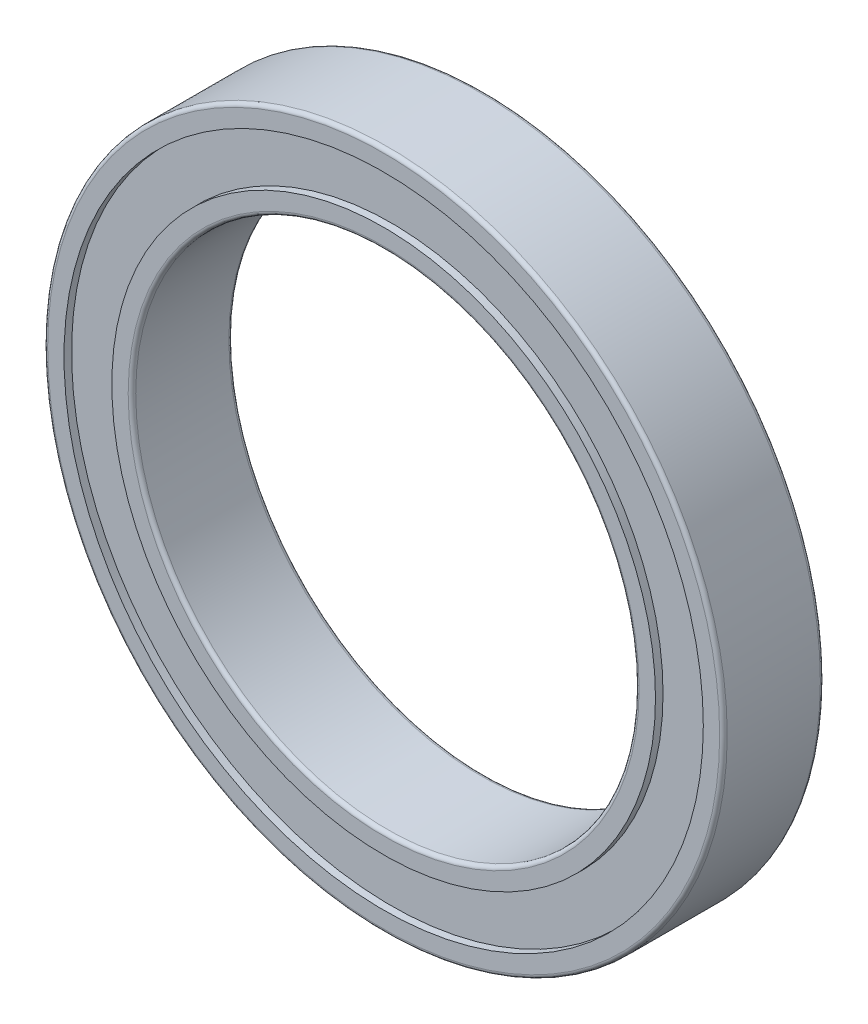
ISO-10303-21;
HEADER;
FILE_DESCRIPTION(('STEP AP214'),'2;1');
FILE_NAME('part.step','',(''),(''),'','','');
FILE_SCHEMA(('AUTOMOTIVE_DESIGN { 1 0 10303 214 1 1 1 1 }'));
ENDSEC;
DATA;
#1=APPLICATION_CONTEXT('core data for automotive mechanical design processes');
#2=APPLICATION_PROTOCOL_DEFINITION('international standard','automotive_design',2000,#1);
#3=PRODUCT_CONTEXT('',#1,'mechanical');
#4=PRODUCT('Part','Part','',(#3));
#5=PRODUCT_RELATED_PRODUCT_CATEGORY('part','',(#4));
#6=PRODUCT_DEFINITION_FORMATION('','',#4);
#7=PRODUCT_DEFINITION_CONTEXT('part definition',#1,'design');
#8=PRODUCT_DEFINITION('design','',#6,#7);
#9=PRODUCT_DEFINITION_SHAPE('','',#8);
#10=(LENGTH_UNIT() NAMED_UNIT(*) SI_UNIT(.MILLI.,.METRE.));
#11=(NAMED_UNIT(*) PLANE_ANGLE_UNIT() SI_UNIT($,.RADIAN.));
#12=(NAMED_UNIT(*) SI_UNIT($,.STERADIAN.) SOLID_ANGLE_UNIT());
#13=UNCERTAINTY_MEASURE_WITH_UNIT(LENGTH_MEASURE(1.E-05),#10,'distance_accuracy_value','');
#14=(GEOMETRIC_REPRESENTATION_CONTEXT(3) GLOBAL_UNCERTAINTY_ASSIGNED_CONTEXT((#13)) GLOBAL_UNIT_ASSIGNED_CONTEXT((#10,
#11,#12)) REPRESENTATION_CONTEXT('',''));
#15=CARTESIAN_POINT('',(0.,0.,0.));
#16=DIRECTION('',(0.,0.,1.));
#17=DIRECTION('',(1.,0.,0.));
#18=AXIS2_PLACEMENT_3D('',#15,#16,#17);
#19=CARTESIAN_POINT('',(0.,0.,0.));
#20=DIRECTION('',(0.,0.,1.));
#21=DIRECTION('',(1.,0.,0.));
#22=AXIS2_PLACEMENT_3D('',#19,#20,#21);
#23=PLANE('',#22);
#24=CARTESIAN_POINT('',(0.,0.,0.));
#25=DIRECTION('',(0.,0.,1.));
#26=DIRECTION('',(1.,0.,0.));
#27=AXIS2_PLACEMENT_3D('',#24,#25,#26);
#28=CIRCLE('',#27,10.15);
#29=CARTESIAN_POINT('',(10.15,0.,0.));
#30=VERTEX_POINT('',#29);
#31=EDGE_CURVE('E62',#30,#30,#28,.T.);
#32=ORIENTED_EDGE('',*,*,#31,.T.);
#33=EDGE_LOOP('',(#32));
#34=FACE_BOUND('',#33,.T.);
#35=CARTESIAN_POINT('',(0.,0.,0.));
#36=DIRECTION('',(0.,0.,1.));
#37=DIRECTION('',(1.,0.,0.));
#38=AXIS2_PLACEMENT_3D('',#35,#36,#37);
#39=CIRCLE('',#38,10.8);
#40=CARTESIAN_POINT('',(10.8,0.,0.));
#41=VERTEX_POINT('',#40);
#42=EDGE_CURVE('E84',#41,#41,#39,.T.);
#43=ORIENTED_EDGE('',*,*,#42,.F.);
#44=EDGE_LOOP('',(#43));
#45=FACE_BOUND('',#44,.T.);
#46=ADVANCED_FACE('F33',(#34,#45),#23,.F.);
#47=CARTESIAN_POINT('',(0.,0.,4.));
#48=DIRECTION('',(0.,0.,1.));
#49=DIRECTION('',(1.,0.,0.));
#50=AXIS2_PLACEMENT_3D('',#47,#48,#49);
#51=PLANE('',#50);
#52=CARTESIAN_POINT('',(0.,0.,4.));
#53=DIRECTION('',(0.,0.,1.));
#54=DIRECTION('',(1.,0.,0.));
#55=AXIS2_PLACEMENT_3D('',#52,#53,#54);
#56=CIRCLE('',#55,10.15);
#57=CARTESIAN_POINT('',(10.15,0.,4.));
#58=VERTEX_POINT('',#57);
#59=EDGE_CURVE('E40',#58,#58,#56,.F.);
#60=ORIENTED_EDGE('',*,*,#59,.T.);
#61=EDGE_LOOP('',(#60));
#62=FACE_BOUND('',#61,.T.);
#63=CARTESIAN_POINT('',(0.,0.,4.));
#64=DIRECTION('',(0.,0.,1.));
#65=DIRECTION('',(1.,0.,0.));
#66=AXIS2_PLACEMENT_3D('',#63,#64,#65);
#67=CIRCLE('',#66,10.8);
#68=CARTESIAN_POINT('',(10.8,0.,4.));
#69=VERTEX_POINT('',#68);
#70=EDGE_CURVE('E72',#69,#69,#67,.T.);
#71=ORIENTED_EDGE('',*,*,#70,.T.);
#72=EDGE_LOOP('',(#71));
#73=FACE_BOUND('',#72,.T.);
#74=ADVANCED_FACE('F101',(#62,#73),#51,.T.);
#75=CARTESIAN_POINT('',(0.,0.,4.));
#76=DIRECTION('',(0.,0.,1.));
#77=DIRECTION('',(1.,0.,0.));
#78=AXIS2_PLACEMENT_3D('',#75,#76,#77);
#79=CIRCLE('',#78,13.35);
#80=CARTESIAN_POINT('',(13.35,0.,4.));
#81=VERTEX_POINT('',#80);
#82=EDGE_CURVE('E10',#81,#81,#79,.T.);
#83=ORIENTED_EDGE('',*,*,#82,.T.);
#84=EDGE_LOOP('',(#83));
#85=FACE_BOUND('',#84,.T.);
#86=CARTESIAN_POINT('',(0.,0.,4.));
#87=DIRECTION('',(0.,0.,1.));
#88=DIRECTION('',(1.,0.,0.));
#89=AXIS2_PLACEMENT_3D('',#86,#87,#88);
#90=CIRCLE('',#89,12.7);
#91=CARTESIAN_POINT('',(12.7,0.,4.));
#92=VERTEX_POINT('',#91);
#93=EDGE_CURVE('E66',#92,#92,#90,.T.);
#94=ORIENTED_EDGE('',*,*,#93,.F.);
#95=EDGE_LOOP('',(#94));
#96=FACE_BOUND('',#95,.T.);
#97=ADVANCED_FACE('F108',(#85,#96),#51,.T.);
#98=CARTESIAN_POINT('',(0.,0.,0.));
#99=DIRECTION('',(0.,0.,1.));
#100=DIRECTION('',(1.,0.,0.));
#101=AXIS2_PLACEMENT_3D('',#98,#99,#100);
#102=CIRCLE('',#101,13.35);
#103=CARTESIAN_POINT('',(13.35,0.,0.));
#104=VERTEX_POINT('',#103);
#105=EDGE_CURVE('E44',#104,#104,#102,.F.);
#106=ORIENTED_EDGE('',*,*,#105,.T.);
#107=EDGE_LOOP('',(#106));
#108=FACE_BOUND('',#107,.T.);
#109=CARTESIAN_POINT('',(0.,0.,0.));
#110=DIRECTION('',(0.,0.,1.));
#111=DIRECTION('',(1.,0.,0.));
#112=AXIS2_PLACEMENT_3D('',#109,#110,#111);
#113=CIRCLE('',#112,12.7);
#114=CARTESIAN_POINT('',(12.7,0.,0.));
#115=VERTEX_POINT('',#114);
#116=EDGE_CURVE('E78',#115,#115,#113,.T.);
#117=ORIENTED_EDGE('',*,*,#116,.T.);
#118=EDGE_LOOP('',(#117));
#119=FACE_BOUND('',#118,.T.);
#120=ADVANCED_FACE('F104',(#108,#119),#23,.F.);
#121=CARTESIAN_POINT('',(0.,0.,4.));
#122=DIRECTION('',(0.,0.,-1.));
#123=DIRECTION('',(-1.,0.,0.));
#124=AXIS2_PLACEMENT_3D('',#121,#122,#123);
#125=CYLINDRICAL_SURFACE('',#124,13.5);
#126=CARTESIAN_POINT('',(0.,0.,0.15));
#127=DIRECTION('',(0.,0.,1.));
#128=DIRECTION('',(1.,0.,0.));
#129=AXIS2_PLACEMENT_3D('',#126,#127,#128);
#130=CIRCLE('',#129,13.5);
#131=CARTESIAN_POINT('',(13.5,0.,0.15));
#132=VERTEX_POINT('',#131);
#133=EDGE_CURVE('E48',#132,#132,#130,.T.);
#134=ORIENTED_EDGE('',*,*,#133,.T.);
#135=EDGE_LOOP('',(#134));
#136=FACE_BOUND('',#135,.T.);
#137=CARTESIAN_POINT('',(0.,0.,3.85));
#138=DIRECTION('',(0.,0.,1.));
#139=DIRECTION('',(1.,0.,0.));
#140=AXIS2_PLACEMENT_3D('',#137,#138,#139);
#141=CIRCLE('',#140,13.5);
#142=CARTESIAN_POINT('',(13.5,0.,3.85));
#143=VERTEX_POINT('',#142);
#144=EDGE_CURVE('E53',#143,#143,#141,.F.);
#145=ORIENTED_EDGE('',*,*,#144,.T.);
#146=EDGE_LOOP('',(#145));
#147=FACE_BOUND('',#146,.T.);
#148=ADVANCED_FACE('F112',(#136,#147),#125,.T.);
#149=CARTESIAN_POINT('',(0.,0.,4.));
#150=DIRECTION('',(0.,0.,-1.));
#151=DIRECTION('',(-1.,0.,0.));
#152=AXIS2_PLACEMENT_3D('',#149,#150,#151);
#153=CYLINDRICAL_SURFACE('',#152,10.);
#154=CARTESIAN_POINT('',(0.,0.,0.15));
#155=DIRECTION('',(0.,0.,1.));
#156=DIRECTION('',(1.,0.,0.));
#157=AXIS2_PLACEMENT_3D('',#154,#155,#156);
#158=CIRCLE('',#157,10.);
#159=CARTESIAN_POINT('',(10.,0.,0.15));
#160=VERTEX_POINT('',#159);
#161=EDGE_CURVE('E56',#160,#160,#158,.F.);
#162=ORIENTED_EDGE('',*,*,#161,.T.);
#163=EDGE_LOOP('',(#162));
#164=FACE_BOUND('',#163,.T.);
#165=CARTESIAN_POINT('',(0.,0.,3.85));
#166=DIRECTION('',(0.,0.,1.));
#167=DIRECTION('',(1.,0.,0.));
#168=AXIS2_PLACEMENT_3D('',#165,#166,#167);
#169=CIRCLE('',#168,10.);
#170=CARTESIAN_POINT('',(10.,0.,3.85));
#171=VERTEX_POINT('',#170);
#172=EDGE_CURVE('E59',#171,#171,#169,.T.);
#173=ORIENTED_EDGE('',*,*,#172,.T.);
#174=EDGE_LOOP('',(#173));
#175=FACE_BOUND('',#174,.T.);
#176=ADVANCED_FACE('F118',(#164,#175),#153,.F.);
#177=CARTESIAN_POINT('',(0.,0.,3.7));
#178=DIRECTION('',(0.,0.,1.));
#179=DIRECTION('',(1.,0.,0.));
#180=AXIS2_PLACEMENT_3D('',#177,#178,#179);
#181=CYLINDRICAL_SURFACE('',#180,12.7);
#182=CARTESIAN_POINT('',(0.,0.,3.7));
#183=DIRECTION('',(0.,0.,1.));
#184=DIRECTION('',(1.,0.,0.));
#185=AXIS2_PLACEMENT_3D('',#182,#183,#184);
#186=CIRCLE('',#185,12.7);
#187=CARTESIAN_POINT('',(12.7,0.,3.7));
#188=VERTEX_POINT('',#187);
#189=EDGE_CURVE('E65',#188,#188,#186,.T.);
#190=ORIENTED_EDGE('',*,*,#189,.F.);
#191=EDGE_LOOP('',(#190));
#192=FACE_BOUND('',#191,.T.);
#193=ORIENTED_EDGE('',*,*,#93,.T.);
#194=EDGE_LOOP('',(#193));
#195=FACE_BOUND('',#194,.T.);
#196=ADVANCED_FACE('F140',(#192,#195),#181,.F.);
#197=CARTESIAN_POINT('',(0.,0.,3.7));
#198=DIRECTION('',(0.,0.,1.));
#199=DIRECTION('',(1.,0.,0.));
#200=AXIS2_PLACEMENT_3D('',#197,#198,#199);
#201=PLANE('',#200);
#202=CARTESIAN_POINT('',(0.,0.,3.7));
#203=DIRECTION('',(0.,0.,1.));
#204=DIRECTION('',(1.,0.,0.));
#205=AXIS2_PLACEMENT_3D('',#202,#203,#204);
#206=CIRCLE('',#205,10.8);
#207=CARTESIAN_POINT('',(10.8,0.,3.7));
#208=VERTEX_POINT('',#207);
#209=EDGE_CURVE('E69',#208,#208,#206,.T.);
#210=ORIENTED_EDGE('',*,*,#209,.F.);
#211=EDGE_LOOP('',(#210));
#212=FACE_BOUND('',#211,.T.);
#213=ORIENTED_EDGE('',*,*,#189,.T.);
#214=EDGE_LOOP('',(#213));
#215=FACE_BOUND('',#214,.T.);
#216=ADVANCED_FACE('F136',(#212,#215),#201,.T.);
#217=CARTESIAN_POINT('',(0.,0.,3.7));
#218=DIRECTION('',(0.,0.,1.));
#219=DIRECTION('',(1.,0.,0.));
#220=AXIS2_PLACEMENT_3D('',#217,#218,#219);
#221=CYLINDRICAL_SURFACE('',#220,10.8);
#222=ORIENTED_EDGE('',*,*,#209,.T.);
#223=EDGE_LOOP('',(#222));
#224=FACE_BOUND('',#223,.T.);
#225=ORIENTED_EDGE('',*,*,#70,.F.);
#226=EDGE_LOOP('',(#225));
#227=FACE_BOUND('',#226,.T.);
#228=ADVANCED_FACE('F130',(#224,#227),#221,.T.);
#229=CARTESIAN_POINT('',(0.,0.,0.5));
#230=DIRECTION('',(0.,0.,1.));
#231=DIRECTION('',(1.,0.,0.));
#232=AXIS2_PLACEMENT_3D('',#229,#230,#231);
#233=PLANE('',#232);
#234=CARTESIAN_POINT('',(0.,0.,0.5));
#235=DIRECTION('',(0.,0.,1.));
#236=DIRECTION('',(1.,0.,0.));
#237=AXIS2_PLACEMENT_3D('',#234,#235,#236);
#238=CIRCLE('',#237,12.7);
#239=CARTESIAN_POINT('',(12.7,0.,0.5));
#240=VERTEX_POINT('',#239);
#241=EDGE_CURVE('E75',#240,#240,#238,.T.);
#242=ORIENTED_EDGE('',*,*,#241,.F.);
#243=EDGE_LOOP('',(#242));
#244=FACE_BOUND('',#243,.T.);
#245=CARTESIAN_POINT('',(0.,0.,0.5));
#246=DIRECTION('',(0.,0.,1.));
#247=DIRECTION('',(1.,0.,0.));
#248=AXIS2_PLACEMENT_3D('',#245,#246,#247);
#249=CIRCLE('',#248,10.8);
#250=CARTESIAN_POINT('',(10.8,0.,0.5));
#251=VERTEX_POINT('',#250);
#252=EDGE_CURVE('E81',#251,#251,#249,.T.);
#253=ORIENTED_EDGE('',*,*,#252,.T.);
#254=EDGE_LOOP('',(#253));
#255=FACE_BOUND('',#254,.T.);
#256=ADVANCED_FACE('F90',(#244,#255),#233,.F.);
#257=CARTESIAN_POINT('',(0.,0.,0.5));
#258=DIRECTION('',(0.,0.,-1.));
#259=DIRECTION('',(-1.,0.,0.));
#260=AXIS2_PLACEMENT_3D('',#257,#258,#259);
#261=CYLINDRICAL_SURFACE('',#260,12.7);
#262=ORIENTED_EDGE('',*,*,#241,.T.);
#263=EDGE_LOOP('',(#262));
#264=FACE_BOUND('',#263,.T.);
#265=ORIENTED_EDGE('',*,*,#116,.F.);
#266=EDGE_LOOP('',(#265));
#267=FACE_BOUND('',#266,.T.);
#268=ADVANCED_FACE('F96',(#264,#267),#261,.F.);
#269=CARTESIAN_POINT('',(0.,0.,0.5));
#270=DIRECTION('',(0.,0.,-1.));
#271=DIRECTION('',(-1.,0.,0.));
#272=AXIS2_PLACEMENT_3D('',#269,#270,#271);
#273=CYLINDRICAL_SURFACE('',#272,10.8);
#274=ORIENTED_EDGE('',*,*,#252,.F.);
#275=EDGE_LOOP('',(#274));
#276=FACE_BOUND('',#275,.T.);
#277=ORIENTED_EDGE('',*,*,#42,.T.);
#278=EDGE_LOOP('',(#277));
#279=FACE_BOUND('',#278,.T.);
#280=ADVANCED_FACE('F92',(#276,#279),#273,.T.);
#281=CARTESIAN_POINT('',(0.,0.,0.15));
#282=DIRECTION('',(0.,0.,1.));
#283=DIRECTION('',(1.,0.,0.));
#284=AXIS2_PLACEMENT_3D('',#281,#282,#283);
#285=TOROIDAL_SURFACE('',#284,10.15,0.15);
#286=ORIENTED_EDGE('',*,*,#161,.F.);
#287=EDGE_LOOP('',(#286));
#288=FACE_BOUND('',#287,.T.);
#289=ORIENTED_EDGE('',*,*,#31,.F.);
#290=EDGE_LOOP('',(#289));
#291=FACE_BOUND('',#290,.T.);
#292=ADVANCED_FACE('F95',(#288,#291),#285,.T.);
#293=CARTESIAN_POINT('',(0.,0.,0.15));
#294=DIRECTION('',(0.,0.,1.));
#295=DIRECTION('',(1.,0.,0.));
#296=AXIS2_PLACEMENT_3D('',#293,#294,#295);
#297=TOROIDAL_SURFACE('',#296,13.35,0.15);
#298=ORIENTED_EDGE('',*,*,#105,.F.);
#299=EDGE_LOOP('',(#298));
#300=FACE_BOUND('',#299,.T.);
#301=ORIENTED_EDGE('',*,*,#133,.F.);
#302=EDGE_LOOP('',(#301));
#303=FACE_BOUND('',#302,.T.);
#304=ADVANCED_FACE('F155',(#300,#303),#297,.T.);
#305=CARTESIAN_POINT('',(0.,0.,3.85));
#306=DIRECTION('',(0.,0.,1.));
#307=DIRECTION('',(1.,0.,0.));
#308=AXIS2_PLACEMENT_3D('',#305,#306,#307);
#309=TOROIDAL_SURFACE('',#308,10.15,0.15);
#310=ORIENTED_EDGE('',*,*,#59,.F.);
#311=EDGE_LOOP('',(#310));
#312=FACE_BOUND('',#311,.T.);
#313=ORIENTED_EDGE('',*,*,#172,.F.);
#314=EDGE_LOOP('',(#313));
#315=FACE_BOUND('',#314,.T.);
#316=ADVANCED_FACE('F153',(#312,#315),#309,.T.);
#317=CARTESIAN_POINT('',(0.,0.,3.85));
#318=DIRECTION('',(0.,0.,1.));
#319=DIRECTION('',(1.,0.,0.));
#320=AXIS2_PLACEMENT_3D('',#317,#318,#319);
#321=TOROIDAL_SURFACE('',#320,13.35,0.15);
#322=ORIENTED_EDGE('',*,*,#144,.F.);
#323=EDGE_LOOP('',(#322));
#324=FACE_BOUND('',#323,.T.);
#325=ORIENTED_EDGE('',*,*,#82,.F.);
#326=EDGE_LOOP('',(#325));
#327=FACE_BOUND('',#326,.T.);
#328=ADVANCED_FACE('F35',(#324,#327),#321,.T.);
#329=CLOSED_SHELL('',(#46,#74,#97,#120,#148,#176,#196,#216,#228,#256,#268,#280,#292,#304,#316,#328));
#330=MANIFOLD_SOLID_BREP('B2',#329);
#331=ADVANCED_BREP_SHAPE_REPRESENTATION('',(#18,#330),#14);
#332=SHAPE_DEFINITION_REPRESENTATION(#9,#331);
ENDSEC;
END-ISO-10303-21;
